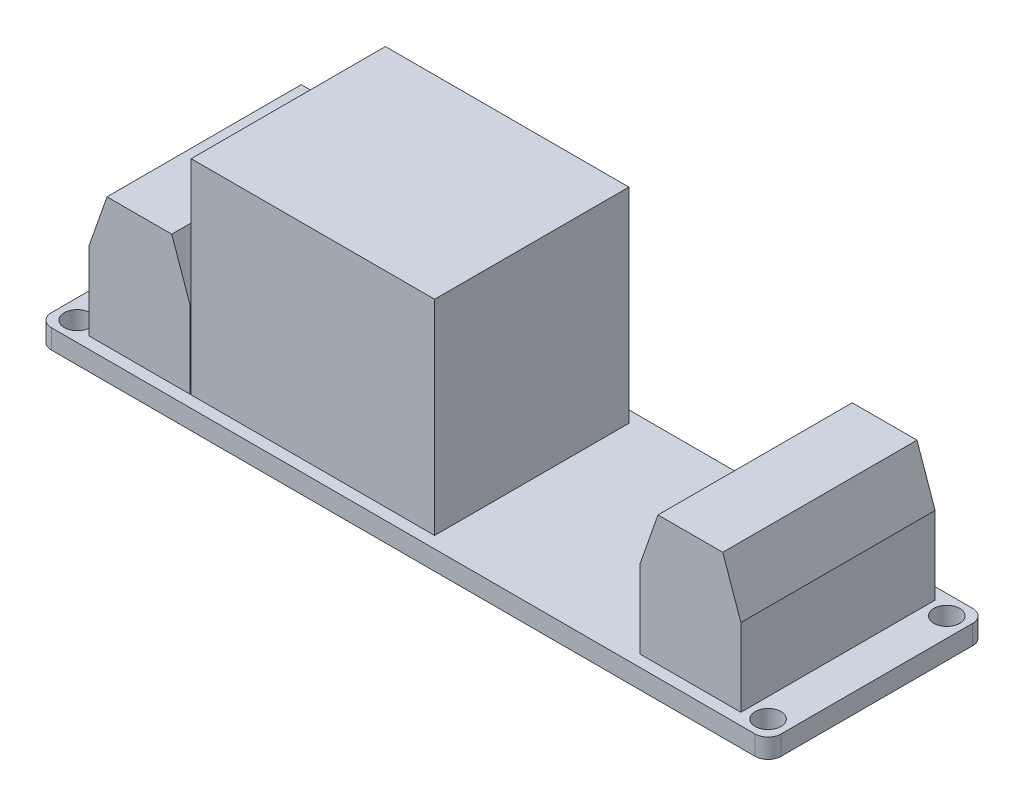
ISO-10303-21;
HEADER;
FILE_DESCRIPTION(('STEP AP214'),'2;1');
FILE_NAME('part.step','',(''),(''),'','','');
FILE_SCHEMA(('AUTOMOTIVE_DESIGN { 1 0 10303 214 1 1 1 1 }'));
ENDSEC;
DATA;
#1=APPLICATION_CONTEXT('core data for automotive mechanical design processes');
#2=APPLICATION_PROTOCOL_DEFINITION('international standard','automotive_design',2000,#1);
#3=PRODUCT_CONTEXT('',#1,'mechanical');
#4=PRODUCT('Part','Part','',(#3));
#5=PRODUCT_RELATED_PRODUCT_CATEGORY('part','',(#4));
#6=PRODUCT_DEFINITION_FORMATION('','',#4);
#7=PRODUCT_DEFINITION_CONTEXT('part definition',#1,'design');
#8=PRODUCT_DEFINITION('design','',#6,#7);
#9=PRODUCT_DEFINITION_SHAPE('','',#8);
#10=(LENGTH_UNIT() NAMED_UNIT(*) SI_UNIT(.MILLI.,.METRE.));
#11=(NAMED_UNIT(*) PLANE_ANGLE_UNIT() SI_UNIT($,.RADIAN.));
#12=(NAMED_UNIT(*) SI_UNIT($,.STERADIAN.) SOLID_ANGLE_UNIT());
#13=UNCERTAINTY_MEASURE_WITH_UNIT(LENGTH_MEASURE(1.E-05),#10,'distance_accuracy_value','');
#14=(GEOMETRIC_REPRESENTATION_CONTEXT(3) GLOBAL_UNCERTAINTY_ASSIGNED_CONTEXT((#13)) GLOBAL_UNIT_ASSIGNED_CONTEXT((#10,
#11,#12)) REPRESENTATION_CONTEXT('',''));
#15=CARTESIAN_POINT('',(0.,0.,0.));
#16=DIRECTION('',(0.,0.,1.));
#17=DIRECTION('',(1.,0.,0.));
#18=AXIS2_PLACEMENT_3D('',#15,#16,#17);
#19=CARTESIAN_POINT('',(0.,1.5,0.));
#20=DIRECTION('',(0.,1.,0.));
#21=DIRECTION('',(0.,0.,1.));
#22=AXIS2_PLACEMENT_3D('',#19,#20,#21);
#23=PLANE('',#22);
#24=DIRECTION('',(-1.,0.,0.));
#25=VECTOR('',#24,1.);
#26=CARTESIAN_POINT('',(-25.175,1.5,7.5));
#27=LINE('',#26,#25);
#28=CARTESIAN_POINT('',(-17.375,1.5,7.5));
#29=VERTEX_POINT('',#28);
#30=CARTESIAN_POINT('',(-25.175,1.5,7.5));
#31=VERTEX_POINT('',#30);
#32=EDGE_CURVE('E244',#29,#31,#27,.T.);
#33=ORIENTED_EDGE('',*,*,#32,.T.);
#34=DIRECTION('',(0.,0.,-1.));
#35=VECTOR('',#34,1.);
#36=CARTESIAN_POINT('',(-25.175,1.5,7.5));
#37=LINE('',#36,#35);
#38=CARTESIAN_POINT('',(-25.175,1.5,-7.5));
#39=VERTEX_POINT('',#38);
#40=EDGE_CURVE('E286',#31,#39,#37,.T.);
#41=ORIENTED_EDGE('',*,*,#40,.T.);
#42=DIRECTION('',(-1.,0.,0.));
#43=VECTOR('',#42,1.);
#44=CARTESIAN_POINT('',(-25.175,1.5,-7.5));
#45=LINE('',#44,#43);
#46=CARTESIAN_POINT('',(-17.375,1.5,-7.5));
#47=VERTEX_POINT('',#46);
#48=EDGE_CURVE('E263',#47,#39,#45,.T.);
#49=ORIENTED_EDGE('',*,*,#48,.F.);
#50=DIRECTION('',(0.,0.,-1.));
#51=VECTOR('',#50,1.);
#52=CARTESIAN_POINT('',(-17.375,1.5,7.5));
#53=LINE('',#52,#51);
#54=EDGE_CURVE('E283',#29,#47,#53,.T.);
#55=ORIENTED_EDGE('',*,*,#54,.F.);
#56=EDGE_LOOP('',(#33,#41,#49,#55));
#57=FACE_BOUND('',#56,.T.);
#58=DIRECTION('',(1.,0.,0.));
#59=VECTOR('',#58,1.);
#60=CARTESIAN_POINT('',(25.175,1.5,7.5));
#61=LINE('',#60,#59);
#62=CARTESIAN_POINT('',(17.375,1.5,7.5));
#63=VERTEX_POINT('',#62);
#64=CARTESIAN_POINT('',(25.175,1.5,7.5));
#65=VERTEX_POINT('',#64);
#66=EDGE_CURVE('E302',#63,#65,#61,.T.);
#67=ORIENTED_EDGE('',*,*,#66,.F.);
#68=DIRECTION('',(0.,0.,-1.));
#69=VECTOR('',#68,1.);
#70=CARTESIAN_POINT('',(17.375,1.5,7.5));
#71=LINE('',#70,#69);
#72=CARTESIAN_POINT('',(17.375,1.5,-7.5));
#73=VERTEX_POINT('',#72);
#74=EDGE_CURVE('E319',#63,#73,#71,.T.);
#75=ORIENTED_EDGE('',*,*,#74,.T.);
#76=DIRECTION('',(1.,0.,0.));
#77=VECTOR('',#76,1.);
#78=CARTESIAN_POINT('',(25.175,1.5,-7.5));
#79=LINE('',#78,#77);
#80=CARTESIAN_POINT('',(25.175,1.5,-7.5));
#81=VERTEX_POINT('',#80);
#82=EDGE_CURVE('E294',#73,#81,#79,.T.);
#83=ORIENTED_EDGE('',*,*,#82,.T.);
#84=DIRECTION('',(0.,0.,-1.));
#85=VECTOR('',#84,1.);
#86=CARTESIAN_POINT('',(25.175,1.5,7.5));
#87=LINE('',#86,#85);
#88=EDGE_CURVE('E304',#65,#81,#87,.T.);
#89=ORIENTED_EDGE('',*,*,#88,.F.);
#90=EDGE_LOOP('',(#67,#75,#83,#89));
#91=FACE_BOUND('',#90,.T.);
#92=CARTESIAN_POINT('',(26.675,1.5,-6.9));
#93=DIRECTION('',(0.,-1.,0.));
#94=DIRECTION('',(0.,0.,1.));
#95=AXIS2_PLACEMENT_3D('',#92,#93,#94);
#96=CIRCLE('',#95,1.);
#97=CARTESIAN_POINT('',(26.675,1.5,-5.9));
#98=VERTEX_POINT('',#97);
#99=EDGE_CURVE('E334',#98,#98,#96,.T.);
#100=ORIENTED_EDGE('',*,*,#99,.T.);
#101=EDGE_LOOP('',(#100));
#102=FACE_BOUND('',#101,.T.);
#103=CARTESIAN_POINT('',(26.675,1.5,6.9));
#104=DIRECTION('',(0.,1.,0.));
#105=DIRECTION('',(0.,0.,-1.));
#106=AXIS2_PLACEMENT_3D('',#103,#104,#105);
#107=CIRCLE('',#106,1.);
#108=CARTESIAN_POINT('',(26.675,1.5,5.9));
#109=VERTEX_POINT('',#108);
#110=EDGE_CURVE('E338',#109,#109,#107,.T.);
#111=ORIENTED_EDGE('',*,*,#110,.F.);
#112=EDGE_LOOP('',(#111));
#113=FACE_BOUND('',#112,.T.);
#114=CARTESIAN_POINT('',(-26.675,1.5,6.9));
#115=DIRECTION('',(0.,-1.,0.));
#116=DIRECTION('',(0.,0.,-1.));
#117=AXIS2_PLACEMENT_3D('',#114,#115,#116);
#118=CIRCLE('',#117,1.);
#119=CARTESIAN_POINT('',(-26.675,1.5,5.9));
#120=VERTEX_POINT('',#119);
#121=EDGE_CURVE('E344',#120,#120,#118,.T.);
#122=ORIENTED_EDGE('',*,*,#121,.T.);
#123=EDGE_LOOP('',(#122));
#124=FACE_BOUND('',#123,.T.);
#125=CARTESIAN_POINT('',(-26.675,1.5,-6.9));
#126=DIRECTION('',(0.,1.,0.));
#127=DIRECTION('',(0.,0.,1.));
#128=AXIS2_PLACEMENT_3D('',#125,#126,#127);
#129=CIRCLE('',#128,1.);
#130=CARTESIAN_POINT('',(-26.675,1.5,-5.9));
#131=VERTEX_POINT('',#130);
#132=EDGE_CURVE('E350',#131,#131,#129,.T.);
#133=ORIENTED_EDGE('',*,*,#132,.F.);
#134=EDGE_LOOP('',(#133));
#135=FACE_BOUND('',#134,.T.);
#136=DIRECTION('',(1.,0.,0.));
#137=VECTOR('',#136,1.);
#138=CARTESIAN_POINT('',(-28.175,1.5,8.4));
#139=LINE('',#138,#137);
#140=CARTESIAN_POINT('',(-27.175,1.5,8.4));
#141=VERTEX_POINT('',#140);
#142=CARTESIAN_POINT('',(27.175,1.5,8.4));
#143=VERTEX_POINT('',#142);
#144=EDGE_CURVE('E369',#141,#143,#139,.T.);
#145=ORIENTED_EDGE('',*,*,#144,.T.);
#146=CARTESIAN_POINT('',(27.175,1.5,7.4));
#147=DIRECTION('',(0.,1.,0.));
#148=DIRECTION('',(0.,0.,1.));
#149=AXIS2_PLACEMENT_3D('',#146,#147,#148);
#150=CIRCLE('',#149,1.);
#151=CARTESIAN_POINT('',(28.175,1.5,7.4));
#152=VERTEX_POINT('',#151);
#153=EDGE_CURVE('E406',#143,#152,#150,.T.);
#154=ORIENTED_EDGE('',*,*,#153,.T.);
#155=DIRECTION('',(0.,0.,-1.));
#156=VECTOR('',#155,1.);
#157=CARTESIAN_POINT('',(28.175,1.5,-8.4));
#158=LINE('',#157,#156);
#159=CARTESIAN_POINT('',(28.175,1.5,-7.4));
#160=VERTEX_POINT('',#159);
#161=EDGE_CURVE('E359',#152,#160,#158,.T.);
#162=ORIENTED_EDGE('',*,*,#161,.T.);
#163=CARTESIAN_POINT('',(27.175,1.5,-7.4));
#164=DIRECTION('',(0.,1.,0.));
#165=DIRECTION('',(0.,0.,1.));
#166=AXIS2_PLACEMENT_3D('',#163,#164,#165);
#167=CIRCLE('',#166,1.);
#168=CARTESIAN_POINT('',(27.175,1.5,-8.4));
#169=VERTEX_POINT('',#168);
#170=EDGE_CURVE('E404',#160,#169,#167,.T.);
#171=ORIENTED_EDGE('',*,*,#170,.T.);
#172=DIRECTION('',(-1.,0.,0.));
#173=VECTOR('',#172,1.);
#174=CARTESIAN_POINT('',(-28.175,1.5,-8.4));
#175=LINE('',#174,#173);
#176=CARTESIAN_POINT('',(-27.175,1.5,-8.4));
#177=VERTEX_POINT('',#176);
#178=EDGE_CURVE('E362',#169,#177,#175,.T.);
#179=ORIENTED_EDGE('',*,*,#178,.T.);
#180=CARTESIAN_POINT('',(-27.175,1.5,-7.4));
#181=DIRECTION('',(0.,1.,0.));
#182=DIRECTION('',(0.,0.,1.));
#183=AXIS2_PLACEMENT_3D('',#180,#181,#182);
#184=CIRCLE('',#183,1.);
#185=CARTESIAN_POINT('',(-28.175,1.5,-7.4));
#186=VERTEX_POINT('',#185);
#187=EDGE_CURVE('E402',#177,#186,#184,.T.);
#188=ORIENTED_EDGE('',*,*,#187,.T.);
#189=DIRECTION('',(0.,0.,1.));
#190=VECTOR('',#189,1.);
#191=CARTESIAN_POINT('',(-28.175,1.5,-8.4));
#192=LINE('',#191,#190);
#193=CARTESIAN_POINT('',(-28.175,1.5,7.4));
#194=VERTEX_POINT('',#193);
#195=EDGE_CURVE('E366',#186,#194,#192,.T.);
#196=ORIENTED_EDGE('',*,*,#195,.T.);
#197=CARTESIAN_POINT('',(-27.175,1.5,7.4));
#198=DIRECTION('',(0.,1.,0.));
#199=DIRECTION('',(0.,0.,1.));
#200=AXIS2_PLACEMENT_3D('',#197,#198,#199);
#201=CIRCLE('',#200,1.);
#202=EDGE_CURVE('E400',#194,#141,#201,.T.);
#203=ORIENTED_EDGE('',*,*,#202,.T.);
#204=EDGE_LOOP('',(#145,#154,#162,#171,#179,#188,#196,#203));
#205=FACE_BOUND('',#204,.T.);
#206=DIRECTION('',(0.,0.,-1.));
#207=VECTOR('',#206,1.);
#208=CARTESIAN_POINT('',(1.52499999999999,1.5,7.5));
#209=LINE('',#208,#207);
#210=CARTESIAN_POINT('',(1.52499999999999,1.5,7.5));
#211=VERTEX_POINT('',#210);
#212=CARTESIAN_POINT('',(1.52499999999999,1.5,-7.5));
#213=VERTEX_POINT('',#212);
#214=EDGE_CURVE('E66',#211,#213,#209,.T.);
#215=ORIENTED_EDGE('',*,*,#214,.F.);
#216=DIRECTION('',(1.,0.,0.));
#217=VECTOR('',#216,1.);
#218=CARTESIAN_POINT('',(-17.275,1.5,7.5));
#219=LINE('',#218,#217);
#220=CARTESIAN_POINT('',(-17.275,1.5,7.5));
#221=VERTEX_POINT('',#220);
#222=EDGE_CURVE('E61',#221,#211,#219,.T.);
#223=ORIENTED_EDGE('',*,*,#222,.F.);
#224=DIRECTION('',(0.,0.,-1.));
#225=VECTOR('',#224,1.);
#226=CARTESIAN_POINT('',(-17.275,1.5,7.5));
#227=LINE('',#226,#225);
#228=CARTESIAN_POINT('',(-17.275,1.5,-7.5));
#229=VERTEX_POINT('',#228);
#230=EDGE_CURVE('E238',#221,#229,#227,.T.);
#231=ORIENTED_EDGE('',*,*,#230,.T.);
#232=DIRECTION('',(1.,0.,0.));
#233=VECTOR('',#232,1.);
#234=CARTESIAN_POINT('',(-17.275,1.5,-7.5));
#235=LINE('',#234,#233);
#236=EDGE_CURVE('E231',#229,#213,#235,.T.);
#237=ORIENTED_EDGE('',*,*,#236,.T.);
#238=EDGE_LOOP('',(#215,#223,#231,#237));
#239=FACE_BOUND('',#238,.T.);
#240=ADVANCED_FACE('F46',(#57,#91,#102,#113,#124,#135,#205,#239),#23,.T.);
#241=CARTESIAN_POINT('',(28.175,1.5,-8.4));
#242=DIRECTION('',(-1.,0.,0.));
#243=DIRECTION('',(0.,0.,1.));
#244=AXIS2_PLACEMENT_3D('',#241,#242,#243);
#245=PLANE('',#244);
#246=ORIENTED_EDGE('',*,*,#161,.F.);
#247=DIRECTION('',(0.,-1.,0.));
#248=VECTOR('',#247,1.);
#249=CARTESIAN_POINT('',(28.175,1.5,7.4));
#250=LINE('',#249,#248);
#251=CARTESIAN_POINT('',(28.175,0.,7.4));
#252=VERTEX_POINT('',#251);
#253=EDGE_CURVE('E384',#152,#252,#250,.T.);
#254=ORIENTED_EDGE('',*,*,#253,.T.);
#255=DIRECTION('',(0.,0.,-1.));
#256=VECTOR('',#255,1.);
#257=CARTESIAN_POINT('',(28.175,0.,-8.4));
#258=LINE('',#257,#256);
#259=CARTESIAN_POINT('',(28.175,0.,-7.4));
#260=VERTEX_POINT('',#259);
#261=EDGE_CURVE('E356',#252,#260,#258,.T.);
#262=ORIENTED_EDGE('',*,*,#261,.T.);
#263=DIRECTION('',(0.,-1.,0.));
#264=VECTOR('',#263,1.);
#265=CARTESIAN_POINT('',(28.175,1.5,-7.4));
#266=LINE('',#265,#264);
#267=EDGE_CURVE('E372',#260,#160,#266,.F.);
#268=ORIENTED_EDGE('',*,*,#267,.T.);
#269=EDGE_LOOP('',(#246,#254,#262,#268));
#270=FACE_BOUND('',#269,.T.);
#271=ADVANCED_FACE('F437',(#270),#245,.F.);
#272=CARTESIAN_POINT('',(-28.175,1.5,-8.4));
#273=DIRECTION('',(0.,0.,1.));
#274=DIRECTION('',(1.,0.,0.));
#275=AXIS2_PLACEMENT_3D('',#272,#273,#274);
#276=PLANE('',#275);
#277=ORIENTED_EDGE('',*,*,#178,.F.);
#278=DIRECTION('',(0.,-1.,0.));
#279=VECTOR('',#278,1.);
#280=CARTESIAN_POINT('',(27.175,1.5,-8.4));
#281=LINE('',#280,#279);
#282=CARTESIAN_POINT('',(27.175,0.,-8.4));
#283=VERTEX_POINT('',#282);
#284=EDGE_CURVE('E410',#169,#283,#281,.T.);
#285=ORIENTED_EDGE('',*,*,#284,.T.);
#286=DIRECTION('',(-1.,0.,0.));
#287=VECTOR('',#286,1.);
#288=CARTESIAN_POINT('',(-28.175,0.,-8.4));
#289=LINE('',#288,#287);
#290=CARTESIAN_POINT('',(-27.175,0.,-8.4));
#291=VERTEX_POINT('',#290);
#292=EDGE_CURVE('E375',#283,#291,#289,.T.);
#293=ORIENTED_EDGE('',*,*,#292,.T.);
#294=DIRECTION('',(0.,-1.,0.));
#295=VECTOR('',#294,1.);
#296=CARTESIAN_POINT('',(-27.175,1.5,-8.4));
#297=LINE('',#296,#295);
#298=EDGE_CURVE('E408',#291,#177,#297,.F.);
#299=ORIENTED_EDGE('',*,*,#298,.T.);
#300=EDGE_LOOP('',(#277,#285,#293,#299));
#301=FACE_BOUND('',#300,.T.);
#302=ADVANCED_FACE('F446',(#301),#276,.F.);
#303=CARTESIAN_POINT('',(-28.175,1.5,-8.4));
#304=DIRECTION('',(1.,0.,0.));
#305=DIRECTION('',(0.,0.,-1.));
#306=AXIS2_PLACEMENT_3D('',#303,#304,#305);
#307=PLANE('',#306);
#308=ORIENTED_EDGE('',*,*,#195,.F.);
#309=DIRECTION('',(0.,-1.,0.));
#310=VECTOR('',#309,1.);
#311=CARTESIAN_POINT('',(-28.175,1.5,-7.4));
#312=LINE('',#311,#310);
#313=CARTESIAN_POINT('',(-28.175,0.,-7.4));
#314=VERTEX_POINT('',#313);
#315=EDGE_CURVE('E13',#186,#314,#312,.T.);
#316=ORIENTED_EDGE('',*,*,#315,.T.);
#317=DIRECTION('',(0.,0.,1.));
#318=VECTOR('',#317,1.);
#319=CARTESIAN_POINT('',(-28.175,0.,-8.4));
#320=LINE('',#319,#318);
#321=CARTESIAN_POINT('',(-28.175,0.,7.4));
#322=VERTEX_POINT('',#321);
#323=EDGE_CURVE('E378',#314,#322,#320,.T.);
#324=ORIENTED_EDGE('',*,*,#323,.T.);
#325=DIRECTION('',(0.,-1.,0.));
#326=VECTOR('',#325,1.);
#327=CARTESIAN_POINT('',(-28.175,1.5,7.4));
#328=LINE('',#327,#326);
#329=EDGE_CURVE('E54',#322,#194,#328,.F.);
#330=ORIENTED_EDGE('',*,*,#329,.T.);
#331=EDGE_LOOP('',(#308,#316,#324,#330));
#332=FACE_BOUND('',#331,.T.);
#333=ADVANCED_FACE('F415',(#332),#307,.F.);
#334=CARTESIAN_POINT('',(-28.175,1.5,8.4));
#335=DIRECTION('',(0.,0.,-1.));
#336=DIRECTION('',(-1.,0.,0.));
#337=AXIS2_PLACEMENT_3D('',#334,#335,#336);
#338=PLANE('',#337);
#339=DIRECTION('',(1.,0.,0.));
#340=VECTOR('',#339,1.);
#341=CARTESIAN_POINT('',(-28.175,0.,8.4));
#342=LINE('',#341,#340);
#343=CARTESIAN_POINT('',(-27.175,0.,8.4));
#344=VERTEX_POINT('',#343);
#345=CARTESIAN_POINT('',(27.175,0.,8.4));
#346=VERTEX_POINT('',#345);
#347=EDGE_CURVE('E363',#344,#346,#342,.T.);
#348=ORIENTED_EDGE('',*,*,#347,.T.);
#349=DIRECTION('',(0.,-1.,0.));
#350=VECTOR('',#349,1.);
#351=CARTESIAN_POINT('',(27.175,1.5,8.4));
#352=LINE('',#351,#350);
#353=EDGE_CURVE('E398',#346,#143,#352,.F.);
#354=ORIENTED_EDGE('',*,*,#353,.T.);
#355=ORIENTED_EDGE('',*,*,#144,.F.);
#356=DIRECTION('',(0.,-1.,0.));
#357=VECTOR('',#356,1.);
#358=CARTESIAN_POINT('',(-27.175,1.5,8.4));
#359=LINE('',#358,#357);
#360=EDGE_CURVE('E395',#141,#344,#359,.T.);
#361=ORIENTED_EDGE('',*,*,#360,.T.);
#362=EDGE_LOOP('',(#348,#354,#355,#361));
#363=FACE_BOUND('',#362,.T.);
#364=ADVANCED_FACE('F426',(#363),#338,.F.);
#365=CARTESIAN_POINT('',(0.,0.,0.));
#366=DIRECTION('',(0.,1.,0.));
#367=DIRECTION('',(0.,0.,1.));
#368=AXIS2_PLACEMENT_3D('',#365,#366,#367);
#369=PLANE('',#368);
#370=CARTESIAN_POINT('',(26.675,0.,-6.9));
#371=DIRECTION('',(0.,-1.,0.));
#372=DIRECTION('',(0.,0.,1.));
#373=AXIS2_PLACEMENT_3D('',#370,#371,#372);
#374=CIRCLE('',#373,1.);
#375=CARTESIAN_POINT('',(26.675,0.,-5.9));
#376=VERTEX_POINT('',#375);
#377=EDGE_CURVE('E335',#376,#376,#374,.T.);
#378=ORIENTED_EDGE('',*,*,#377,.F.);
#379=EDGE_LOOP('',(#378));
#380=FACE_BOUND('',#379,.T.);
#381=CARTESIAN_POINT('',(26.675,0.,6.9));
#382=DIRECTION('',(0.,1.,0.));
#383=DIRECTION('',(0.,0.,-1.));
#384=AXIS2_PLACEMENT_3D('',#381,#382,#383);
#385=CIRCLE('',#384,1.);
#386=CARTESIAN_POINT('',(26.675,0.,5.9));
#387=VERTEX_POINT('',#386);
#388=EDGE_CURVE('E341',#387,#387,#385,.T.);
#389=ORIENTED_EDGE('',*,*,#388,.T.);
#390=EDGE_LOOP('',(#389));
#391=FACE_BOUND('',#390,.T.);
#392=CARTESIAN_POINT('',(-26.675,0.,6.9));
#393=DIRECTION('',(0.,-1.,0.));
#394=DIRECTION('',(0.,0.,-1.));
#395=AXIS2_PLACEMENT_3D('',#392,#393,#394);
#396=CIRCLE('',#395,1.);
#397=CARTESIAN_POINT('',(-26.675,0.,5.9));
#398=VERTEX_POINT('',#397);
#399=EDGE_CURVE('E347',#398,#398,#396,.T.);
#400=ORIENTED_EDGE('',*,*,#399,.F.);
#401=EDGE_LOOP('',(#400));
#402=FACE_BOUND('',#401,.T.);
#403=CARTESIAN_POINT('',(-26.675,0.,-6.9));
#404=DIRECTION('',(0.,1.,0.));
#405=DIRECTION('',(0.,0.,1.));
#406=AXIS2_PLACEMENT_3D('',#403,#404,#405);
#407=CIRCLE('',#406,1.);
#408=CARTESIAN_POINT('',(-26.675,0.,-5.9));
#409=VERTEX_POINT('',#408);
#410=EDGE_CURVE('E353',#409,#409,#407,.T.);
#411=ORIENTED_EDGE('',*,*,#410,.T.);
#412=EDGE_LOOP('',(#411));
#413=FACE_BOUND('',#412,.T.);
#414=ORIENTED_EDGE('',*,*,#261,.F.);
#415=CARTESIAN_POINT('',(27.175,0.,7.4));
#416=DIRECTION('',(0.,1.,0.));
#417=DIRECTION('',(0.,0.,1.));
#418=AXIS2_PLACEMENT_3D('',#415,#416,#417);
#419=CIRCLE('',#418,1.);
#420=EDGE_CURVE('E393',#252,#346,#419,.F.);
#421=ORIENTED_EDGE('',*,*,#420,.T.);
#422=ORIENTED_EDGE('',*,*,#347,.F.);
#423=CARTESIAN_POINT('',(-27.175,0.,7.4));
#424=DIRECTION('',(0.,1.,0.));
#425=DIRECTION('',(0.,0.,1.));
#426=AXIS2_PLACEMENT_3D('',#423,#424,#425);
#427=CIRCLE('',#426,1.);
#428=EDGE_CURVE('E387',#344,#322,#427,.F.);
#429=ORIENTED_EDGE('',*,*,#428,.T.);
#430=ORIENTED_EDGE('',*,*,#323,.F.);
#431=CARTESIAN_POINT('',(-27.175,0.,-7.4));
#432=DIRECTION('',(0.,1.,0.));
#433=DIRECTION('',(0.,0.,1.));
#434=AXIS2_PLACEMENT_3D('',#431,#432,#433);
#435=CIRCLE('',#434,1.);
#436=EDGE_CURVE('E389',#314,#291,#435,.F.);
#437=ORIENTED_EDGE('',*,*,#436,.T.);
#438=ORIENTED_EDGE('',*,*,#292,.F.);
#439=CARTESIAN_POINT('',(27.175,0.,-7.4));
#440=DIRECTION('',(0.,1.,0.));
#441=DIRECTION('',(0.,0.,1.));
#442=AXIS2_PLACEMENT_3D('',#439,#440,#441);
#443=CIRCLE('',#442,1.);
#444=EDGE_CURVE('E391',#283,#260,#443,.F.);
#445=ORIENTED_EDGE('',*,*,#444,.T.);
#446=EDGE_LOOP('',(#414,#421,#422,#429,#430,#437,#438,#445));
#447=FACE_BOUND('',#446,.T.);
#448=ADVANCED_FACE('F430',(#380,#391,#402,#413,#447),#369,.F.);
#449=CARTESIAN_POINT('',(-26.675,0.,-6.9));
#450=DIRECTION('',(0.,1.,0.));
#451=DIRECTION('',(0.,0.,1.));
#452=AXIS2_PLACEMENT_3D('',#449,#450,#451);
#453=CYLINDRICAL_SURFACE('',#452,1.);
#454=ORIENTED_EDGE('',*,*,#410,.F.);
#455=EDGE_LOOP('',(#454));
#456=FACE_BOUND('',#455,.T.);
#457=ORIENTED_EDGE('',*,*,#132,.T.);
#458=EDGE_LOOP('',(#457));
#459=FACE_BOUND('',#458,.T.);
#460=ADVANCED_FACE('F467',(#456,#459),#453,.F.);
#461=CARTESIAN_POINT('',(-26.675,0.,6.9));
#462=DIRECTION('',(0.,1.,0.));
#463=DIRECTION('',(0.,0.,1.));
#464=AXIS2_PLACEMENT_3D('',#461,#462,#463);
#465=CYLINDRICAL_SURFACE('',#464,1.);
#466=ORIENTED_EDGE('',*,*,#399,.T.);
#467=EDGE_LOOP('',(#466));
#468=FACE_BOUND('',#467,.T.);
#469=ORIENTED_EDGE('',*,*,#121,.F.);
#470=EDGE_LOOP('',(#469));
#471=FACE_BOUND('',#470,.T.);
#472=ADVANCED_FACE('F489',(#468,#471),#465,.F.);
#473=CARTESIAN_POINT('',(26.675,0.,6.9));
#474=DIRECTION('',(0.,1.,0.));
#475=DIRECTION('',(0.,0.,1.));
#476=AXIS2_PLACEMENT_3D('',#473,#474,#475);
#477=CYLINDRICAL_SURFACE('',#476,1.);
#478=ORIENTED_EDGE('',*,*,#388,.F.);
#479=EDGE_LOOP('',(#478));
#480=FACE_BOUND('',#479,.T.);
#481=ORIENTED_EDGE('',*,*,#110,.T.);
#482=EDGE_LOOP('',(#481));
#483=FACE_BOUND('',#482,.T.);
#484=ADVANCED_FACE('F483',(#480,#483),#477,.F.);
#485=CARTESIAN_POINT('',(26.675,0.,-6.9));
#486=DIRECTION('',(0.,1.,0.));
#487=DIRECTION('',(0.,0.,1.));
#488=AXIS2_PLACEMENT_3D('',#485,#486,#487);
#489=CYLINDRICAL_SURFACE('',#488,1.);
#490=ORIENTED_EDGE('',*,*,#377,.T.);
#491=EDGE_LOOP('',(#490));
#492=FACE_BOUND('',#491,.T.);
#493=ORIENTED_EDGE('',*,*,#99,.F.);
#494=EDGE_LOOP('',(#493));
#495=FACE_BOUND('',#494,.T.);
#496=ADVANCED_FACE('F479',(#492,#495),#489,.F.);
#497=CARTESIAN_POINT('',(27.175,1.5,7.4));
#498=DIRECTION('',(0.,-1.,0.));
#499=DIRECTION('',(0.,0.,-1.));
#500=AXIS2_PLACEMENT_3D('',#497,#498,#499);
#501=CYLINDRICAL_SURFACE('',#500,1.);
#502=ORIENTED_EDGE('',*,*,#153,.F.);
#503=ORIENTED_EDGE('',*,*,#353,.F.);
#504=ORIENTED_EDGE('',*,*,#420,.F.);
#505=ORIENTED_EDGE('',*,*,#253,.F.);
#506=EDGE_LOOP('',(#502,#503,#504,#505));
#507=FACE_BOUND('',#506,.T.);
#508=ADVANCED_FACE('F434',(#507),#501,.T.);
#509=CARTESIAN_POINT('',(27.175,1.5,-7.4));
#510=DIRECTION('',(0.,-1.,0.));
#511=DIRECTION('',(0.,0.,-1.));
#512=AXIS2_PLACEMENT_3D('',#509,#510,#511);
#513=CYLINDRICAL_SURFACE('',#512,1.);
#514=ORIENTED_EDGE('',*,*,#170,.F.);
#515=ORIENTED_EDGE('',*,*,#267,.F.);
#516=ORIENTED_EDGE('',*,*,#444,.F.);
#517=ORIENTED_EDGE('',*,*,#284,.F.);
#518=EDGE_LOOP('',(#514,#515,#516,#517));
#519=FACE_BOUND('',#518,.T.);
#520=ADVANCED_FACE('F443',(#519),#513,.T.);
#521=CARTESIAN_POINT('',(-27.175,1.5,-7.4));
#522=DIRECTION('',(0.,-1.,0.));
#523=DIRECTION('',(0.,0.,-1.));
#524=AXIS2_PLACEMENT_3D('',#521,#522,#523);
#525=CYLINDRICAL_SURFACE('',#524,1.);
#526=ORIENTED_EDGE('',*,*,#187,.F.);
#527=ORIENTED_EDGE('',*,*,#298,.F.);
#528=ORIENTED_EDGE('',*,*,#436,.F.);
#529=ORIENTED_EDGE('',*,*,#315,.F.);
#530=EDGE_LOOP('',(#526,#527,#528,#529));
#531=FACE_BOUND('',#530,.T.);
#532=ADVANCED_FACE('F449',(#531),#525,.T.);
#533=CARTESIAN_POINT('',(-27.175,1.5,7.4));
#534=DIRECTION('',(0.,-1.,0.));
#535=DIRECTION('',(0.,0.,-1.));
#536=AXIS2_PLACEMENT_3D('',#533,#534,#535);
#537=CYLINDRICAL_SURFACE('',#536,1.);
#538=ORIENTED_EDGE('',*,*,#202,.F.);
#539=ORIENTED_EDGE('',*,*,#329,.F.);
#540=ORIENTED_EDGE('',*,*,#428,.F.);
#541=ORIENTED_EDGE('',*,*,#360,.F.);
#542=EDGE_LOOP('',(#538,#539,#540,#541));
#543=FACE_BOUND('',#542,.T.);
#544=ADVANCED_FACE('F48',(#543),#537,.T.);
#545=CARTESIAN_POINT('',(25.175,1.5,7.5));
#546=DIRECTION('',(-1.,0.,0.));
#547=DIRECTION('',(0.,-1.,0.));
#548=AXIS2_PLACEMENT_3D('',#545,#546,#547);
#549=PLANE('',#548);
#550=DIRECTION('',(0.,1.,0.));
#551=VECTOR('',#550,1.);
#552=CARTESIAN_POINT('',(25.175,1.5,-7.5));
#553=LINE('',#552,#551);
#554=CARTESIAN_POINT('',(25.175,7.5,-7.5));
#555=VERTEX_POINT('',#554);
#556=EDGE_CURVE('E289',#81,#555,#553,.T.);
#557=ORIENTED_EDGE('',*,*,#556,.T.);
#558=DIRECTION('',(0.,0.,-1.));
#559=VECTOR('',#558,1.);
#560=CARTESIAN_POINT('',(25.175,7.5,7.5));
#561=LINE('',#560,#559);
#562=CARTESIAN_POINT('',(25.175,7.5,7.5));
#563=VERTEX_POINT('',#562);
#564=EDGE_CURVE('E331',#563,#555,#561,.T.);
#565=ORIENTED_EDGE('',*,*,#564,.F.);
#566=DIRECTION('',(0.,1.,0.));
#567=VECTOR('',#566,1.);
#568=CARTESIAN_POINT('',(25.175,1.5,7.5));
#569=LINE('',#568,#567);
#570=EDGE_CURVE('E290',#65,#563,#569,.T.);
#571=ORIENTED_EDGE('',*,*,#570,.F.);
#572=ORIENTED_EDGE('',*,*,#88,.T.);
#573=EDGE_LOOP('',(#557,#565,#571,#572));
#574=FACE_BOUND('',#573,.T.);
#575=ADVANCED_FACE('F455',(#574),#549,.F.);
#576=CARTESIAN_POINT('',(23.775,11.5,7.5));
#577=DIRECTION('',(-0.943858356366017,-0.330350424728106,0.));
#578=DIRECTION('',(0.330350424728106,-0.943858356366018,0.));
#579=AXIS2_PLACEMENT_3D('',#576,#577,#578);
#580=PLANE('',#579);
#581=DIRECTION('',(-0.330350424728106,0.943858356366018,0.));
#582=VECTOR('',#581,1.);
#583=CARTESIAN_POINT('',(23.775,11.5,-7.5));
#584=LINE('',#583,#582);
#585=CARTESIAN_POINT('',(23.775,11.5,-7.5));
#586=VERTEX_POINT('',#585);
#587=EDGE_CURVE('E307',#555,#586,#584,.T.);
#588=ORIENTED_EDGE('',*,*,#587,.T.);
#589=DIRECTION('',(0.,0.,-1.));
#590=VECTOR('',#589,1.);
#591=CARTESIAN_POINT('',(23.775,11.5,7.5));
#592=LINE('',#591,#590);
#593=CARTESIAN_POINT('',(23.775,11.5,7.5));
#594=VERTEX_POINT('',#593);
#595=EDGE_CURVE('E328',#594,#586,#592,.T.);
#596=ORIENTED_EDGE('',*,*,#595,.F.);
#597=DIRECTION('',(-0.330350424728106,0.943858356366018,0.));
#598=VECTOR('',#597,1.);
#599=CARTESIAN_POINT('',(23.775,11.5,7.5));
#600=LINE('',#599,#598);
#601=EDGE_CURVE('E293',#563,#594,#600,.T.);
#602=ORIENTED_EDGE('',*,*,#601,.F.);
#603=ORIENTED_EDGE('',*,*,#564,.T.);
#604=EDGE_LOOP('',(#588,#596,#602,#603));
#605=FACE_BOUND('',#604,.T.);
#606=ADVANCED_FACE('F585',(#605),#580,.F.);
#607=CARTESIAN_POINT('',(23.775,11.5,7.5));
#608=DIRECTION('',(0.,-1.,0.));
#609=DIRECTION('',(0.,0.,-1.));
#610=AXIS2_PLACEMENT_3D('',#607,#608,#609);
#611=PLANE('',#610);
#612=DIRECTION('',(-1.,0.,0.));
#613=VECTOR('',#612,1.);
#614=CARTESIAN_POINT('',(23.775,11.5,-7.5));
#615=LINE('',#614,#613);
#616=CARTESIAN_POINT('',(18.775,11.5,-7.5));
#617=VERTEX_POINT('',#616);
#618=EDGE_CURVE('E309',#586,#617,#615,.T.);
#619=ORIENTED_EDGE('',*,*,#618,.T.);
#620=DIRECTION('',(0.,0.,-1.));
#621=VECTOR('',#620,1.);
#622=CARTESIAN_POINT('',(18.775,11.5,7.5));
#623=LINE('',#622,#621);
#624=CARTESIAN_POINT('',(18.775,11.5,7.5));
#625=VERTEX_POINT('',#624);
#626=EDGE_CURVE('E325',#625,#617,#623,.T.);
#627=ORIENTED_EDGE('',*,*,#626,.F.);
#628=DIRECTION('',(-1.,0.,0.));
#629=VECTOR('',#628,1.);
#630=CARTESIAN_POINT('',(23.775,11.5,7.5));
#631=LINE('',#630,#629);
#632=EDGE_CURVE('E296',#594,#625,#631,.T.);
#633=ORIENTED_EDGE('',*,*,#632,.F.);
#634=ORIENTED_EDGE('',*,*,#595,.T.);
#635=EDGE_LOOP('',(#619,#627,#633,#634));
#636=FACE_BOUND('',#635,.T.);
#637=ADVANCED_FACE('F593',(#636),#611,.F.);
#638=CARTESIAN_POINT('',(18.775,11.5,7.5));
#639=DIRECTION('',(0.943858356366017,-0.330350424728106,0.));
#640=DIRECTION('',(0.330350424728106,0.943858356366018,0.));
#641=AXIS2_PLACEMENT_3D('',#638,#639,#640);
#642=PLANE('',#641);
#643=DIRECTION('',(-0.330350424728106,-0.943858356366018,0.));
#644=VECTOR('',#643,1.);
#645=CARTESIAN_POINT('',(18.775,11.5,-7.5));
#646=LINE('',#645,#644);
#647=CARTESIAN_POINT('',(17.375,7.5,-7.5));
#648=VERTEX_POINT('',#647);
#649=EDGE_CURVE('E311',#617,#648,#646,.T.);
#650=ORIENTED_EDGE('',*,*,#649,.T.);
#651=DIRECTION('',(0.,0.,-1.));
#652=VECTOR('',#651,1.);
#653=CARTESIAN_POINT('',(17.375,7.5,7.5));
#654=LINE('',#653,#652);
#655=CARTESIAN_POINT('',(17.375,7.5,7.5));
#656=VERTEX_POINT('',#655);
#657=EDGE_CURVE('E322',#656,#648,#654,.T.);
#658=ORIENTED_EDGE('',*,*,#657,.F.);
#659=DIRECTION('',(-0.330350424728106,-0.943858356366018,0.));
#660=VECTOR('',#659,1.);
#661=CARTESIAN_POINT('',(18.775,11.5,7.5));
#662=LINE('',#661,#660);
#663=EDGE_CURVE('E298',#625,#656,#662,.T.);
#664=ORIENTED_EDGE('',*,*,#663,.F.);
#665=ORIENTED_EDGE('',*,*,#626,.T.);
#666=EDGE_LOOP('',(#650,#658,#664,#665));
#667=FACE_BOUND('',#666,.T.);
#668=ADVANCED_FACE('F601',(#667),#642,.F.);
#669=CARTESIAN_POINT('',(17.375,1.5,7.5));
#670=DIRECTION('',(1.,0.,0.));
#671=DIRECTION('',(0.,0.,-1.));
#672=AXIS2_PLACEMENT_3D('',#669,#670,#671);
#673=PLANE('',#672);
#674=DIRECTION('',(0.,-1.,0.));
#675=VECTOR('',#674,1.);
#676=CARTESIAN_POINT('',(17.375,1.5,-7.5));
#677=LINE('',#676,#675);
#678=EDGE_CURVE('E313',#648,#73,#677,.T.);
#679=ORIENTED_EDGE('',*,*,#678,.T.);
#680=ORIENTED_EDGE('',*,*,#74,.F.);
#681=DIRECTION('',(0.,-1.,0.));
#682=VECTOR('',#681,1.);
#683=CARTESIAN_POINT('',(17.375,1.5,7.5));
#684=LINE('',#683,#682);
#685=EDGE_CURVE('E300',#656,#63,#684,.T.);
#686=ORIENTED_EDGE('',*,*,#685,.F.);
#687=ORIENTED_EDGE('',*,*,#657,.T.);
#688=EDGE_LOOP('',(#679,#680,#686,#687));
#689=FACE_BOUND('',#688,.T.);
#690=ADVANCED_FACE('F610',(#689),#673,.F.);
#691=CARTESIAN_POINT('',(0.,0.,7.5));
#692=DIRECTION('',(0.,0.,1.));
#693=DIRECTION('',(1.,0.,0.));
#694=AXIS2_PLACEMENT_3D('',#691,#692,#693);
#695=PLANE('',#694);
#696=ORIENTED_EDGE('',*,*,#570,.T.);
#697=ORIENTED_EDGE('',*,*,#601,.T.);
#698=ORIENTED_EDGE('',*,*,#632,.T.);
#699=ORIENTED_EDGE('',*,*,#663,.T.);
#700=ORIENTED_EDGE('',*,*,#685,.T.);
#701=ORIENTED_EDGE('',*,*,#66,.T.);
#702=EDGE_LOOP('',(#696,#697,#698,#699,#700,#701));
#703=FACE_BOUND('',#702,.T.);
#704=ADVANCED_FACE('F619',(#703),#695,.T.);
#705=CARTESIAN_POINT('',(0.,0.,-7.5));
#706=DIRECTION('',(0.,0.,1.));
#707=DIRECTION('',(1.,0.,0.));
#708=AXIS2_PLACEMENT_3D('',#705,#706,#707);
#709=PLANE('',#708);
#710=ORIENTED_EDGE('',*,*,#556,.F.);
#711=ORIENTED_EDGE('',*,*,#82,.F.);
#712=ORIENTED_EDGE('',*,*,#678,.F.);
#713=ORIENTED_EDGE('',*,*,#649,.F.);
#714=ORIENTED_EDGE('',*,*,#618,.F.);
#715=ORIENTED_EDGE('',*,*,#587,.F.);
#716=EDGE_LOOP('',(#710,#711,#712,#713,#714,#715));
#717=FACE_BOUND('',#716,.T.);
#718=ADVANCED_FACE('F628',(#717),#709,.F.);
#719=CARTESIAN_POINT('',(-25.175,1.5,7.5));
#720=DIRECTION('',(-1.,0.,0.));
#721=DIRECTION('',(0.,-1.,0.));
#722=AXIS2_PLACEMENT_3D('',#719,#720,#721);
#723=PLANE('',#722);
#724=DIRECTION('',(0.,1.,0.));
#725=VECTOR('',#724,1.);
#726=CARTESIAN_POINT('',(-25.175,1.5,-7.5));
#727=LINE('',#726,#725);
#728=CARTESIAN_POINT('',(-25.175,7.5,-7.5));
#729=VERTEX_POINT('',#728);
#730=EDGE_CURVE('E240',#39,#729,#727,.T.);
#731=ORIENTED_EDGE('',*,*,#730,.F.);
#732=ORIENTED_EDGE('',*,*,#40,.F.);
#733=DIRECTION('',(0.,1.,0.));
#734=VECTOR('',#733,1.);
#735=CARTESIAN_POINT('',(-25.175,1.5,7.5));
#736=LINE('',#735,#734);
#737=CARTESIAN_POINT('',(-25.175,7.5,7.5));
#738=VERTEX_POINT('',#737);
#739=EDGE_CURVE('E241',#31,#738,#736,.T.);
#740=ORIENTED_EDGE('',*,*,#739,.T.);
#741=DIRECTION('',(0.,0.,-1.));
#742=VECTOR('',#741,1.);
#743=CARTESIAN_POINT('',(-25.175,7.5,7.5));
#744=LINE('',#743,#742);
#745=EDGE_CURVE('E260',#738,#729,#744,.T.);
#746=ORIENTED_EDGE('',*,*,#745,.T.);
#747=EDGE_LOOP('',(#731,#732,#740,#746));
#748=FACE_BOUND('',#747,.T.);
#749=ADVANCED_FACE('F637',(#748),#723,.T.);
#750=CARTESIAN_POINT('',(-17.375,1.5,7.5));
#751=DIRECTION('',(1.,0.,0.));
#752=DIRECTION('',(0.,0.,-1.));
#753=AXIS2_PLACEMENT_3D('',#750,#751,#752);
#754=PLANE('',#753);
#755=DIRECTION('',(0.,-1.,0.));
#756=VECTOR('',#755,1.);
#757=CARTESIAN_POINT('',(-17.375,1.5,-7.5));
#758=LINE('',#757,#756);
#759=CARTESIAN_POINT('',(-17.375,7.5,-7.5));
#760=VERTEX_POINT('',#759);
#761=EDGE_CURVE('E266',#760,#47,#758,.T.);
#762=ORIENTED_EDGE('',*,*,#761,.F.);
#763=DIRECTION('',(0.,0.,-1.));
#764=VECTOR('',#763,1.);
#765=CARTESIAN_POINT('',(-17.375,7.5,7.5));
#766=LINE('',#765,#764);
#767=CARTESIAN_POINT('',(-17.375,7.5,7.5));
#768=VERTEX_POINT('',#767);
#769=EDGE_CURVE('E281',#768,#760,#766,.T.);
#770=ORIENTED_EDGE('',*,*,#769,.F.);
#771=DIRECTION('',(0.,-1.,0.));
#772=VECTOR('',#771,1.);
#773=CARTESIAN_POINT('',(-17.375,1.5,7.5));
#774=LINE('',#773,#772);
#775=EDGE_CURVE('E248',#768,#29,#774,.T.);
#776=ORIENTED_EDGE('',*,*,#775,.T.);
#777=ORIENTED_EDGE('',*,*,#54,.T.);
#778=EDGE_LOOP('',(#762,#770,#776,#777));
#779=FACE_BOUND('',#778,.T.);
#780=ADVANCED_FACE('F646',(#779),#754,.T.);
#781=CARTESIAN_POINT('',(-18.775,11.5,7.5));
#782=DIRECTION('',(0.943858356366017,0.330350424728106,0.));
#783=DIRECTION('',(-0.330350424728106,0.943858356366018,0.));
#784=AXIS2_PLACEMENT_3D('',#781,#782,#783);
#785=PLANE('',#784);
#786=DIRECTION('',(0.330350424728106,-0.943858356366018,0.));
#787=VECTOR('',#786,1.);
#788=CARTESIAN_POINT('',(-18.775,11.5,-7.5));
#789=LINE('',#788,#787);
#790=CARTESIAN_POINT('',(-18.775,11.5,-7.5));
#791=VERTEX_POINT('',#790);
#792=EDGE_CURVE('E268',#791,#760,#789,.T.);
#793=ORIENTED_EDGE('',*,*,#792,.F.);
#794=DIRECTION('',(0.,0.,-1.));
#795=VECTOR('',#794,1.);
#796=CARTESIAN_POINT('',(-18.775,11.5,7.5));
#797=LINE('',#796,#795);
#798=CARTESIAN_POINT('',(-18.775,11.5,7.5));
#799=VERTEX_POINT('',#798);
#800=EDGE_CURVE('E279',#799,#791,#797,.T.);
#801=ORIENTED_EDGE('',*,*,#800,.F.);
#802=DIRECTION('',(0.330350424728106,-0.943858356366018,0.));
#803=VECTOR('',#802,1.);
#804=CARTESIAN_POINT('',(-18.775,11.5,7.5));
#805=LINE('',#804,#803);
#806=EDGE_CURVE('E251',#799,#768,#805,.T.);
#807=ORIENTED_EDGE('',*,*,#806,.T.);
#808=ORIENTED_EDGE('',*,*,#769,.T.);
#809=EDGE_LOOP('',(#793,#801,#807,#808));
#810=FACE_BOUND('',#809,.T.);
#811=ADVANCED_FACE('F655',(#810),#785,.T.);
#812=CARTESIAN_POINT('',(-23.775,11.5,7.5));
#813=DIRECTION('',(0.,1.,0.));
#814=DIRECTION('',(0.,0.,1.));
#815=AXIS2_PLACEMENT_3D('',#812,#813,#814);
#816=PLANE('',#815);
#817=DIRECTION('',(1.,0.,0.));
#818=VECTOR('',#817,1.);
#819=CARTESIAN_POINT('',(-23.775,11.5,-7.5));
#820=LINE('',#819,#818);
#821=CARTESIAN_POINT('',(-23.775,11.5,-7.5));
#822=VERTEX_POINT('',#821);
#823=EDGE_CURVE('E271',#822,#791,#820,.T.);
#824=ORIENTED_EDGE('',*,*,#823,.F.);
#825=DIRECTION('',(0.,0.,-1.));
#826=VECTOR('',#825,1.);
#827=CARTESIAN_POINT('',(-23.775,11.5,7.5));
#828=LINE('',#827,#826);
#829=CARTESIAN_POINT('',(-23.775,11.5,7.5));
#830=VERTEX_POINT('',#829);
#831=EDGE_CURVE('E277',#830,#822,#828,.T.);
#832=ORIENTED_EDGE('',*,*,#831,.F.);
#833=DIRECTION('',(1.,0.,0.));
#834=VECTOR('',#833,1.);
#835=CARTESIAN_POINT('',(-23.775,11.5,7.5));
#836=LINE('',#835,#834);
#837=EDGE_CURVE('E254',#830,#799,#836,.T.);
#838=ORIENTED_EDGE('',*,*,#837,.T.);
#839=ORIENTED_EDGE('',*,*,#800,.T.);
#840=EDGE_LOOP('',(#824,#832,#838,#839));
#841=FACE_BOUND('',#840,.T.);
#842=ADVANCED_FACE('F664',(#841),#816,.T.);
#843=CARTESIAN_POINT('',(-23.775,11.5,7.5));
#844=DIRECTION('',(-0.943858356366017,0.330350424728106,0.));
#845=DIRECTION('',(-0.330350424728106,-0.943858356366018,0.));
#846=AXIS2_PLACEMENT_3D('',#843,#844,#845);
#847=PLANE('',#846);
#848=DIRECTION('',(0.330350424728106,0.943858356366018,0.));
#849=VECTOR('',#848,1.);
#850=CARTESIAN_POINT('',(-23.775,11.5,-7.5));
#851=LINE('',#850,#849);
#852=EDGE_CURVE('E245',#729,#822,#851,.T.);
#853=ORIENTED_EDGE('',*,*,#852,.F.);
#854=ORIENTED_EDGE('',*,*,#745,.F.);
#855=DIRECTION('',(0.330350424728106,0.943858356366018,0.));
#856=VECTOR('',#855,1.);
#857=CARTESIAN_POINT('',(-23.775,11.5,7.5));
#858=LINE('',#857,#856);
#859=EDGE_CURVE('E257',#738,#830,#858,.T.);
#860=ORIENTED_EDGE('',*,*,#859,.T.);
#861=ORIENTED_EDGE('',*,*,#831,.T.);
#862=EDGE_LOOP('',(#853,#854,#860,#861));
#863=FACE_BOUND('',#862,.T.);
#864=ADVANCED_FACE('F673',(#863),#847,.T.);
#865=CARTESIAN_POINT('',(0.,0.,7.5));
#866=DIRECTION('',(0.,0.,1.));
#867=DIRECTION('',(-1.,0.,0.));
#868=AXIS2_PLACEMENT_3D('',#865,#866,#867);
#869=PLANE('',#868);
#870=ORIENTED_EDGE('',*,*,#739,.F.);
#871=ORIENTED_EDGE('',*,*,#32,.F.);
#872=ORIENTED_EDGE('',*,*,#775,.F.);
#873=ORIENTED_EDGE('',*,*,#806,.F.);
#874=ORIENTED_EDGE('',*,*,#837,.F.);
#875=ORIENTED_EDGE('',*,*,#859,.F.);
#876=EDGE_LOOP('',(#870,#871,#872,#873,#874,#875));
#877=FACE_BOUND('',#876,.T.);
#878=ADVANCED_FACE('F682',(#877),#869,.T.);
#879=CARTESIAN_POINT('',(0.,0.,-7.5));
#880=DIRECTION('',(0.,0.,1.));
#881=DIRECTION('',(-1.,0.,0.));
#882=AXIS2_PLACEMENT_3D('',#879,#880,#881);
#883=PLANE('',#882);
#884=ORIENTED_EDGE('',*,*,#730,.T.);
#885=ORIENTED_EDGE('',*,*,#852,.T.);
#886=ORIENTED_EDGE('',*,*,#823,.T.);
#887=ORIENTED_EDGE('',*,*,#792,.T.);
#888=ORIENTED_EDGE('',*,*,#761,.T.);
#889=ORIENTED_EDGE('',*,*,#48,.T.);
#890=EDGE_LOOP('',(#884,#885,#886,#887,#888,#889));
#891=FACE_BOUND('',#890,.T.);
#892=ADVANCED_FACE('F691',(#891),#883,.F.);
#893=CARTESIAN_POINT('',(-17.275,1.5,7.5));
#894=DIRECTION('',(1.,0.,0.));
#895=DIRECTION('',(0.,0.,-1.));
#896=AXIS2_PLACEMENT_3D('',#893,#894,#895);
#897=PLANE('',#896);
#898=DIRECTION('',(0.,-1.,0.));
#899=VECTOR('',#898,1.);
#900=CARTESIAN_POINT('',(-17.275,1.5,-7.5));
#901=LINE('',#900,#899);
#902=CARTESIAN_POINT('',(-17.275,17.3,-7.5));
#903=VERTEX_POINT('',#902);
#904=EDGE_CURVE('E228',#903,#229,#901,.T.);
#905=ORIENTED_EDGE('',*,*,#904,.T.);
#906=ORIENTED_EDGE('',*,*,#230,.F.);
#907=DIRECTION('',(0.,-1.,0.));
#908=VECTOR('',#907,1.);
#909=CARTESIAN_POINT('',(-17.275,1.5,7.5));
#910=LINE('',#909,#908);
#911=CARTESIAN_POINT('',(-17.275,17.3,7.5));
#912=VERTEX_POINT('',#911);
#913=EDGE_CURVE('E235',#912,#221,#910,.T.);
#914=ORIENTED_EDGE('',*,*,#913,.F.);
#915=DIRECTION('',(0.,0.,-1.));
#916=VECTOR('',#915,1.);
#917=CARTESIAN_POINT('',(-17.275,17.3,7.5));
#918=LINE('',#917,#916);
#919=EDGE_CURVE('E219',#912,#903,#918,.T.);
#920=ORIENTED_EDGE('',*,*,#919,.T.);
#921=EDGE_LOOP('',(#905,#906,#914,#920));
#922=FACE_BOUND('',#921,.T.);
#923=ADVANCED_FACE('F700',(#922),#897,.F.);
#924=CARTESIAN_POINT('',(1.52499999999999,1.5,7.5));
#925=DIRECTION('',(-1.,0.,0.));
#926=DIRECTION('',(0.,0.,1.));
#927=AXIS2_PLACEMENT_3D('',#924,#925,#926);
#928=PLANE('',#927);
#929=DIRECTION('',(0.,1.,0.));
#930=VECTOR('',#929,1.);
#931=CARTESIAN_POINT('',(1.52499999999999,1.5,-7.5));
#932=LINE('',#931,#930);
#933=CARTESIAN_POINT('',(1.52499999999999,17.3,-7.5));
#934=VERTEX_POINT('',#933);
#935=EDGE_CURVE('E216',#213,#934,#932,.T.);
#936=ORIENTED_EDGE('',*,*,#935,.T.);
#937=DIRECTION('',(0.,0.,-1.));
#938=VECTOR('',#937,1.);
#939=CARTESIAN_POINT('',(1.52499999999999,17.3,7.5));
#940=LINE('',#939,#938);
#941=CARTESIAN_POINT('',(1.52499999999999,17.3,7.5));
#942=VERTEX_POINT('',#941);
#943=EDGE_CURVE('E213',#942,#934,#940,.T.);
#944=ORIENTED_EDGE('',*,*,#943,.F.);
#945=DIRECTION('',(0.,1.,0.));
#946=VECTOR('',#945,1.);
#947=CARTESIAN_POINT('',(1.52499999999999,1.5,7.5));
#948=LINE('',#947,#946);
#949=EDGE_CURVE('E204',#211,#942,#948,.T.);
#950=ORIENTED_EDGE('',*,*,#949,.F.);
#951=ORIENTED_EDGE('',*,*,#214,.T.);
#952=EDGE_LOOP('',(#936,#944,#950,#951));
#953=FACE_BOUND('',#952,.T.);
#954=ADVANCED_FACE('F214',(#953),#928,.F.);
#955=CARTESIAN_POINT('',(-17.275,17.3,7.5));
#956=DIRECTION('',(0.,-1.,0.));
#957=DIRECTION('',(0.,0.,-1.));
#958=AXIS2_PLACEMENT_3D('',#955,#956,#957);
#959=PLANE('',#958);
#960=DIRECTION('',(-1.,0.,0.));
#961=VECTOR('',#960,1.);
#962=CARTESIAN_POINT('',(-17.275,17.3,-7.5));
#963=LINE('',#962,#961);
#964=EDGE_CURVE('E234',#934,#903,#963,.T.);
#965=ORIENTED_EDGE('',*,*,#964,.T.);
#966=ORIENTED_EDGE('',*,*,#919,.F.);
#967=DIRECTION('',(-1.,0.,0.));
#968=VECTOR('',#967,1.);
#969=CARTESIAN_POINT('',(-17.275,17.3,7.5));
#970=LINE('',#969,#968);
#971=EDGE_CURVE('E208',#942,#912,#970,.T.);
#972=ORIENTED_EDGE('',*,*,#971,.F.);
#973=ORIENTED_EDGE('',*,*,#943,.T.);
#974=EDGE_LOOP('',(#965,#966,#972,#973));
#975=FACE_BOUND('',#974,.T.);
#976=ADVANCED_FACE('F221',(#975),#959,.F.);
#977=CARTESIAN_POINT('',(0.,0.,7.5));
#978=DIRECTION('',(0.,0.,-1.));
#979=DIRECTION('',(-1.,0.,0.));
#980=AXIS2_PLACEMENT_3D('',#977,#978,#979);
#981=PLANE('',#980);
#982=ORIENTED_EDGE('',*,*,#913,.T.);
#983=ORIENTED_EDGE('',*,*,#222,.T.);
#984=ORIENTED_EDGE('',*,*,#949,.T.);
#985=ORIENTED_EDGE('',*,*,#971,.T.);
#986=EDGE_LOOP('',(#982,#983,#984,#985));
#987=FACE_BOUND('',#986,.T.);
#988=ADVANCED_FACE('F206',(#987),#981,.F.);
#989=CARTESIAN_POINT('',(0.,0.,-7.5));
#990=DIRECTION('',(0.,0.,-1.));
#991=DIRECTION('',(-1.,0.,0.));
#992=AXIS2_PLACEMENT_3D('',#989,#990,#991);
#993=PLANE('',#992);
#994=ORIENTED_EDGE('',*,*,#904,.F.);
#995=ORIENTED_EDGE('',*,*,#964,.F.);
#996=ORIENTED_EDGE('',*,*,#935,.F.);
#997=ORIENTED_EDGE('',*,*,#236,.F.);
#998=EDGE_LOOP('',(#994,#995,#996,#997));
#999=FACE_BOUND('',#998,.T.);
#1000=ADVANCED_FACE('F735',(#999),#993,.T.);
#1001=CLOSED_SHELL('',(#240,#271,#302,#333,#364,#448,#460,#472,#484,#496,#508,#520,#532,#544,
#575,#606,#637,#668,#690,#704,#718,#749,#780,#811,#842,#864,#878,#892,#923,#954,#976,#988,#1000));
#1002=MANIFOLD_SOLID_BREP('B2',#1001);
#1003=ADVANCED_BREP_SHAPE_REPRESENTATION('',(#18,#1002),#14);
#1004=SHAPE_DEFINITION_REPRESENTATION(#9,#1003);
ENDSEC;
END-ISO-10303-21;
